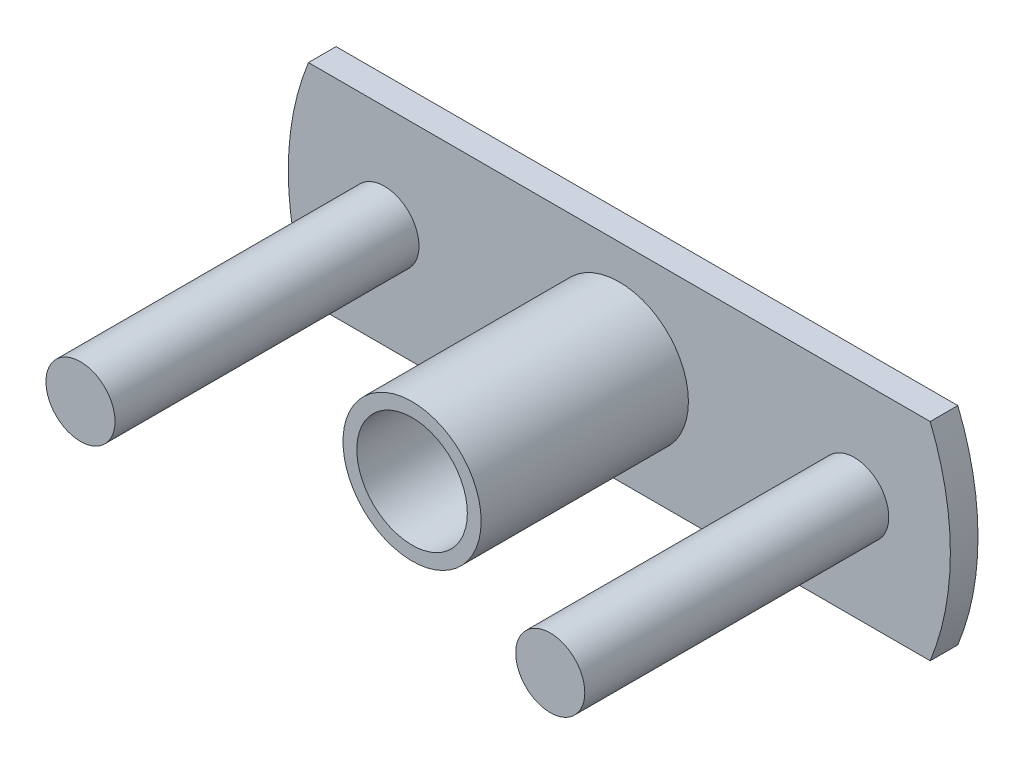
ISO-10303-21;
HEADER;
FILE_DESCRIPTION(('STEP AP214'),'2;1');
FILE_NAME('part.step','',(''),(''),'','','');
FILE_SCHEMA(('AUTOMOTIVE_DESIGN { 1 0 10303 214 1 1 1 1 }'));
ENDSEC;
DATA;
#1=APPLICATION_CONTEXT('core data for automotive mechanical design processes');
#2=APPLICATION_PROTOCOL_DEFINITION('international standard','automotive_design',2000,#1);
#3=PRODUCT_CONTEXT('',#1,'mechanical');
#4=PRODUCT('Part','Part','',(#3));
#5=PRODUCT_RELATED_PRODUCT_CATEGORY('part','',(#4));
#6=PRODUCT_DEFINITION_FORMATION('','',#4);
#7=PRODUCT_DEFINITION_CONTEXT('part definition',#1,'design');
#8=PRODUCT_DEFINITION('design','',#6,#7);
#9=PRODUCT_DEFINITION_SHAPE('','',#8);
#10=(LENGTH_UNIT() NAMED_UNIT(*) SI_UNIT(.MILLI.,.METRE.));
#11=(NAMED_UNIT(*) PLANE_ANGLE_UNIT() SI_UNIT($,.RADIAN.));
#12=(NAMED_UNIT(*) SI_UNIT($,.STERADIAN.) SOLID_ANGLE_UNIT());
#13=UNCERTAINTY_MEASURE_WITH_UNIT(LENGTH_MEASURE(1.E-05),#10,'distance_accuracy_value','');
#14=(GEOMETRIC_REPRESENTATION_CONTEXT(3) GLOBAL_UNCERTAINTY_ASSIGNED_CONTEXT((#13)) GLOBAL_UNIT_ASSIGNED_CONTEXT((#10,
#11,#12)) REPRESENTATION_CONTEXT('',''));
#15=CARTESIAN_POINT('',(0.,0.,0.));
#16=DIRECTION('',(0.,0.,1.));
#17=DIRECTION('',(1.,0.,0.));
#18=AXIS2_PLACEMENT_3D('',#15,#16,#17);
#19=CARTESIAN_POINT('',(-3.95950378226084,0.,2.));
#20=DIRECTION('',(0.,0.,-1.));
#21=DIRECTION('',(-1.,0.,0.));
#22=AXIS2_PLACEMENT_3D('',#19,#20,#21);
#23=CYLINDRICAL_SURFACE('',#22,20.);
#24=CARTESIAN_POINT('',(-3.95950378226084,0.,0.));
#25=DIRECTION('',(0.,0.,1.));
#26=DIRECTION('',(1.,0.,0.));
#27=AXIS2_PLACEMENT_3D('',#24,#25,#26);
#28=CIRCLE('',#27,20.);
#29=CARTESIAN_POINT('',(-22.5,7.5,0.));
#30=VERTEX_POINT('',#29);
#31=CARTESIAN_POINT('',(-22.5,-7.5,0.));
#32=VERTEX_POINT('',#31);
#33=EDGE_CURVE('E110',#30,#32,#28,.T.);
#34=ORIENTED_EDGE('',*,*,#33,.T.);
#35=DIRECTION('',(0.,0.,-1.));
#36=VECTOR('',#35,1.);
#37=CARTESIAN_POINT('',(-22.5,-7.5,2.));
#38=LINE('',#37,#36);
#39=CARTESIAN_POINT('',(-22.5,-7.5,2.));
#40=VERTEX_POINT('',#39);
#41=EDGE_CURVE('E42',#40,#32,#38,.T.);
#42=ORIENTED_EDGE('',*,*,#41,.F.);
#43=CARTESIAN_POINT('',(-3.95950378226084,0.,2.));
#44=DIRECTION('',(0.,0.,1.));
#45=DIRECTION('',(1.,0.,0.));
#46=AXIS2_PLACEMENT_3D('',#43,#44,#45);
#47=CIRCLE('',#46,20.);
#48=CARTESIAN_POINT('',(-22.5,7.5,2.));
#49=VERTEX_POINT('',#48);
#50=EDGE_CURVE('E91',#49,#40,#47,.T.);
#51=ORIENTED_EDGE('',*,*,#50,.F.);
#52=DIRECTION('',(0.,0.,-1.));
#53=VECTOR('',#52,1.);
#54=CARTESIAN_POINT('',(-22.5,7.5,2.));
#55=LINE('',#54,#53);
#56=EDGE_CURVE('E57',#49,#30,#55,.T.);
#57=ORIENTED_EDGE('',*,*,#56,.T.);
#58=EDGE_LOOP('',(#34,#42,#51,#57));
#59=FACE_BOUND('',#58,.T.);
#60=ADVANCED_FACE('F39',(#59),#23,.T.);
#61=CARTESIAN_POINT('',(-22.5,-7.5,2.));
#62=DIRECTION('',(0.,1.,0.));
#63=DIRECTION('',(0.,0.,1.));
#64=AXIS2_PLACEMENT_3D('',#61,#62,#63);
#65=PLANE('',#64);
#66=DIRECTION('',(1.,0.,0.));
#67=VECTOR('',#66,1.);
#68=CARTESIAN_POINT('',(-22.5,-7.5,0.));
#69=LINE('',#68,#67);
#70=CARTESIAN_POINT('',(22.5,-7.49999999999999,0.));
#71=VERTEX_POINT('',#70);
#72=EDGE_CURVE('E98',#32,#71,#69,.T.);
#73=ORIENTED_EDGE('',*,*,#72,.T.);
#74=DIRECTION('',(0.,0.,-1.));
#75=VECTOR('',#74,1.);
#76=CARTESIAN_POINT('',(22.5,-7.49999999999999,2.));
#77=LINE('',#76,#75);
#78=CARTESIAN_POINT('',(22.5,-7.49999999999999,2.));
#79=VERTEX_POINT('',#78);
#80=EDGE_CURVE('E96',#79,#71,#77,.T.);
#81=ORIENTED_EDGE('',*,*,#80,.F.);
#82=DIRECTION('',(1.,0.,0.));
#83=VECTOR('',#82,1.);
#84=CARTESIAN_POINT('',(-22.5,-7.5,2.));
#85=LINE('',#84,#83);
#86=EDGE_CURVE('E83',#40,#79,#85,.T.);
#87=ORIENTED_EDGE('',*,*,#86,.F.);
#88=ORIENTED_EDGE('',*,*,#41,.T.);
#89=EDGE_LOOP('',(#73,#81,#87,#88));
#90=FACE_BOUND('',#89,.T.);
#91=ADVANCED_FACE('F97',(#90),#65,.F.);
#92=CARTESIAN_POINT('',(3.95950378226085,0.,2.));
#93=DIRECTION('',(0.,0.,-1.));
#94=DIRECTION('',(-1.,0.,0.));
#95=AXIS2_PLACEMENT_3D('',#92,#93,#94);
#96=CYLINDRICAL_SURFACE('',#95,20.);
#97=CARTESIAN_POINT('',(3.95950378226085,0.,0.));
#98=DIRECTION('',(0.,0.,-1.));
#99=DIRECTION('',(-1.,0.,0.));
#100=AXIS2_PLACEMENT_3D('',#97,#98,#99);
#101=CIRCLE('',#100,20.);
#102=CARTESIAN_POINT('',(22.5,7.5,0.));
#103=VERTEX_POINT('',#102);
#104=EDGE_CURVE('E116',#103,#71,#101,.T.);
#105=ORIENTED_EDGE('',*,*,#104,.F.);
#106=DIRECTION('',(0.,0.,-1.));
#107=VECTOR('',#106,1.);
#108=CARTESIAN_POINT('',(22.5,7.5,2.));
#109=LINE('',#108,#107);
#110=CARTESIAN_POINT('',(22.5,7.5,2.));
#111=VERTEX_POINT('',#110);
#112=EDGE_CURVE('E71',#111,#103,#109,.T.);
#113=ORIENTED_EDGE('',*,*,#112,.F.);
#114=CARTESIAN_POINT('',(3.95950378226085,0.,2.));
#115=DIRECTION('',(0.,0.,-1.));
#116=DIRECTION('',(-1.,0.,0.));
#117=AXIS2_PLACEMENT_3D('',#114,#115,#116);
#118=CIRCLE('',#117,20.);
#119=EDGE_CURVE('E90',#111,#79,#118,.T.);
#120=ORIENTED_EDGE('',*,*,#119,.T.);
#121=ORIENTED_EDGE('',*,*,#80,.T.);
#122=EDGE_LOOP('',(#105,#113,#120,#121));
#123=FACE_BOUND('',#122,.T.);
#124=ADVANCED_FACE('F102',(#123),#96,.T.);
#125=CARTESIAN_POINT('',(-22.5,7.5,2.));
#126=DIRECTION('',(0.,1.,0.));
#127=DIRECTION('',(0.,0.,1.));
#128=AXIS2_PLACEMENT_3D('',#125,#126,#127);
#129=PLANE('',#128);
#130=DIRECTION('',(1.,0.,0.));
#131=VECTOR('',#130,1.);
#132=CARTESIAN_POINT('',(-22.5,7.5,0.));
#133=LINE('',#132,#131);
#134=EDGE_CURVE('E119',#30,#103,#133,.T.);
#135=ORIENTED_EDGE('',*,*,#134,.F.);
#136=ORIENTED_EDGE('',*,*,#56,.F.);
#137=DIRECTION('',(1.,0.,0.));
#138=VECTOR('',#137,1.);
#139=CARTESIAN_POINT('',(-22.5,7.5,2.));
#140=LINE('',#139,#138);
#141=EDGE_CURVE('E104',#49,#111,#140,.T.);
#142=ORIENTED_EDGE('',*,*,#141,.T.);
#143=ORIENTED_EDGE('',*,*,#112,.T.);
#144=EDGE_LOOP('',(#135,#136,#142,#143));
#145=FACE_BOUND('',#144,.T.);
#146=ADVANCED_FACE('F129',(#145),#129,.T.);
#147=CARTESIAN_POINT('',(-3.95950378226084,0.,2.));
#148=DIRECTION('',(0.,0.,1.));
#149=DIRECTION('',(1.,0.,0.));
#150=AXIS2_PLACEMENT_3D('',#147,#148,#149);
#151=PLANE('',#150);
#152=CARTESIAN_POINT('',(17.,0.,2.));
#153=DIRECTION('',(0.,0.,1.));
#154=DIRECTION('',(1.,0.,0.));
#155=AXIS2_PLACEMENT_3D('',#152,#153,#154);
#156=CIRCLE('',#155,2.5);
#157=CARTESIAN_POINT('',(19.5,0.,2.));
#158=VERTEX_POINT('',#157);
#159=EDGE_CURVE('E256',#158,#158,#156,.T.);
#160=ORIENTED_EDGE('',*,*,#159,.F.);
#161=EDGE_LOOP('',(#160));
#162=FACE_BOUND('',#161,.T.);
#163=CARTESIAN_POINT('',(-17.,0.,2.));
#164=DIRECTION('',(0.,0.,1.));
#165=DIRECTION('',(1.,0.,0.));
#166=AXIS2_PLACEMENT_3D('',#163,#164,#165);
#167=CIRCLE('',#166,2.5);
#168=CARTESIAN_POINT('',(-14.5,0.,2.));
#169=VERTEX_POINT('',#168);
#170=EDGE_CURVE('E255',#169,#169,#167,.T.);
#171=ORIENTED_EDGE('',*,*,#170,.F.);
#172=EDGE_LOOP('',(#171));
#173=FACE_BOUND('',#172,.T.);
#174=CARTESIAN_POINT('',(0.,0.,2.));
#175=DIRECTION('',(0.,0.,1.));
#176=DIRECTION('',(1.,0.,0.));
#177=AXIS2_PLACEMENT_3D('',#174,#175,#176);
#178=CIRCLE('',#177,5.);
#179=CARTESIAN_POINT('',(5.,0.,2.));
#180=VERTEX_POINT('',#179);
#181=EDGE_CURVE('E11',#180,#180,#178,.T.);
#182=ORIENTED_EDGE('',*,*,#181,.F.);
#183=EDGE_LOOP('',(#182));
#184=FACE_BOUND('',#183,.T.);
#185=ORIENTED_EDGE('',*,*,#50,.T.);
#186=ORIENTED_EDGE('',*,*,#86,.T.);
#187=ORIENTED_EDGE('',*,*,#119,.F.);
#188=ORIENTED_EDGE('',*,*,#141,.F.);
#189=EDGE_LOOP('',(#185,#186,#187,#188));
#190=FACE_BOUND('',#189,.T.);
#191=ADVANCED_FACE('F87',(#162,#173,#184,#190),#151,.T.);
#192=CARTESIAN_POINT('',(-3.95950378226084,0.,0.));
#193=DIRECTION('',(0.,0.,1.));
#194=DIRECTION('',(1.,0.,0.));
#195=AXIS2_PLACEMENT_3D('',#192,#193,#194);
#196=PLANE('',#195);
#197=ORIENTED_EDGE('',*,*,#33,.F.);
#198=ORIENTED_EDGE('',*,*,#134,.T.);
#199=ORIENTED_EDGE('',*,*,#104,.T.);
#200=ORIENTED_EDGE('',*,*,#72,.F.);
#201=EDGE_LOOP('',(#197,#198,#199,#200));
#202=FACE_BOUND('',#201,.T.);
#203=ADVANCED_FACE('F128',(#202),#196,.F.);
#204=CARTESIAN_POINT('',(0.,0.,17.));
#205=DIRECTION('',(0.,0.,-1.));
#206=DIRECTION('',(-1.,0.,0.));
#207=AXIS2_PLACEMENT_3D('',#204,#205,#206);
#208=CYLINDRICAL_SURFACE('',#207,5.);
#209=CARTESIAN_POINT('',(0.,0.,17.));
#210=DIRECTION('',(0.,0.,1.));
#211=DIRECTION('',(1.,0.,0.));
#212=AXIS2_PLACEMENT_3D('',#209,#210,#211);
#213=CIRCLE('',#212,5.);
#214=CARTESIAN_POINT('',(5.,0.,17.));
#215=VERTEX_POINT('',#214);
#216=EDGE_CURVE('E113',#215,#215,#213,.T.);
#217=ORIENTED_EDGE('',*,*,#216,.F.);
#218=EDGE_LOOP('',(#217));
#219=FACE_BOUND('',#218,.T.);
#220=ORIENTED_EDGE('',*,*,#181,.T.);
#221=EDGE_LOOP('',(#220));
#222=FACE_BOUND('',#221,.T.);
#223=ADVANCED_FACE('F164',(#219,#222),#208,.T.);
#224=CARTESIAN_POINT('',(0.,0.,17.));
#225=DIRECTION('',(0.,0.,1.));
#226=DIRECTION('',(1.,0.,0.));
#227=AXIS2_PLACEMENT_3D('',#224,#225,#226);
#228=PLANE('',#227);
#229=CARTESIAN_POINT('',(0.,0.,17.));
#230=DIRECTION('',(0.,0.,1.));
#231=DIRECTION('',(1.,0.,0.));
#232=AXIS2_PLACEMENT_3D('',#229,#230,#231);
#233=CIRCLE('',#232,4.);
#234=CARTESIAN_POINT('',(4.,0.,17.));
#235=VERTEX_POINT('',#234);
#236=EDGE_CURVE('E268',#235,#235,#233,.T.);
#237=ORIENTED_EDGE('',*,*,#236,.F.);
#238=EDGE_LOOP('',(#237));
#239=FACE_BOUND('',#238,.T.);
#240=ORIENTED_EDGE('',*,*,#216,.T.);
#241=EDGE_LOOP('',(#240));
#242=FACE_BOUND('',#241,.T.);
#243=ADVANCED_FACE('F172',(#239,#242),#228,.T.);
#244=CARTESIAN_POINT('',(0.,0.,7.));
#245=DIRECTION('',(0.,0.,1.));
#246=DIRECTION('',(1.,0.,0.));
#247=AXIS2_PLACEMENT_3D('',#244,#245,#246);
#248=CYLINDRICAL_SURFACE('',#247,4.);
#249=CARTESIAN_POINT('',(0.,0.,7.));
#250=DIRECTION('',(0.,0.,1.));
#251=DIRECTION('',(1.,0.,0.));
#252=AXIS2_PLACEMENT_3D('',#249,#250,#251);
#253=CIRCLE('',#252,4.);
#254=CARTESIAN_POINT('',(4.,0.,7.));
#255=VERTEX_POINT('',#254);
#256=EDGE_CURVE('E270',#255,#255,#253,.T.);
#257=ORIENTED_EDGE('',*,*,#256,.F.);
#258=EDGE_LOOP('',(#257));
#259=FACE_BOUND('',#258,.T.);
#260=ORIENTED_EDGE('',*,*,#236,.T.);
#261=EDGE_LOOP('',(#260));
#262=FACE_BOUND('',#261,.T.);
#263=ADVANCED_FACE('F182',(#259,#262),#248,.F.);
#264=CARTESIAN_POINT('',(0.,0.,7.));
#265=DIRECTION('',(0.,0.,1.));
#266=DIRECTION('',(1.,0.,0.));
#267=AXIS2_PLACEMENT_3D('',#264,#265,#266);
#268=PLANE('',#267);
#269=ORIENTED_EDGE('',*,*,#256,.T.);
#270=EDGE_LOOP('',(#269));
#271=FACE_BOUND('',#270,.T.);
#272=ADVANCED_FACE('F192',(#271),#268,.T.);
#273=CARTESIAN_POINT('',(-17.,0.,24.));
#274=DIRECTION('',(0.,0.,-1.));
#275=DIRECTION('',(-1.,0.,0.));
#276=AXIS2_PLACEMENT_3D('',#273,#274,#275);
#277=CYLINDRICAL_SURFACE('',#276,2.5);
#278=CARTESIAN_POINT('',(-17.,0.,24.));
#279=DIRECTION('',(0.,0.,1.));
#280=DIRECTION('',(1.,0.,0.));
#281=AXIS2_PLACEMENT_3D('',#278,#279,#280);
#282=CIRCLE('',#281,2.5);
#283=CARTESIAN_POINT('',(-14.5,0.,24.));
#284=VERTEX_POINT('',#283);
#285=EDGE_CURVE('E261',#284,#284,#282,.T.);
#286=ORIENTED_EDGE('',*,*,#285,.F.);
#287=EDGE_LOOP('',(#286));
#288=FACE_BOUND('',#287,.T.);
#289=ORIENTED_EDGE('',*,*,#170,.T.);
#290=EDGE_LOOP('',(#289));
#291=FACE_BOUND('',#290,.T.);
#292=ADVANCED_FACE('F202',(#288,#291),#277,.T.);
#293=CARTESIAN_POINT('',(-17.,0.,24.));
#294=DIRECTION('',(0.,0.,1.));
#295=DIRECTION('',(1.,0.,0.));
#296=AXIS2_PLACEMENT_3D('',#293,#294,#295);
#297=PLANE('',#296);
#298=ORIENTED_EDGE('',*,*,#285,.T.);
#299=EDGE_LOOP('',(#298));
#300=FACE_BOUND('',#299,.T.);
#301=ADVANCED_FACE('F217',(#300),#297,.T.);
#302=CARTESIAN_POINT('',(17.,0.,24.));
#303=DIRECTION('',(0.,0.,-1.));
#304=DIRECTION('',(-1.,0.,0.));
#305=AXIS2_PLACEMENT_3D('',#302,#303,#304);
#306=CYLINDRICAL_SURFACE('',#305,2.5);
#307=CARTESIAN_POINT('',(17.,0.,24.));
#308=DIRECTION('',(0.,0.,1.));
#309=DIRECTION('',(1.,0.,0.));
#310=AXIS2_PLACEMENT_3D('',#307,#308,#309);
#311=CIRCLE('',#310,2.5);
#312=CARTESIAN_POINT('',(19.5,0.,24.));
#313=VERTEX_POINT('',#312);
#314=EDGE_CURVE('E253',#313,#313,#311,.T.);
#315=ORIENTED_EDGE('',*,*,#314,.F.);
#316=EDGE_LOOP('',(#315));
#317=FACE_BOUND('',#316,.T.);
#318=ORIENTED_EDGE('',*,*,#159,.T.);
#319=EDGE_LOOP('',(#318));
#320=FACE_BOUND('',#319,.T.);
#321=ADVANCED_FACE('F227',(#317,#320),#306,.T.);
#322=CARTESIAN_POINT('',(17.,0.,24.));
#323=DIRECTION('',(0.,0.,1.));
#324=DIRECTION('',(1.,0.,0.));
#325=AXIS2_PLACEMENT_3D('',#322,#323,#324);
#326=PLANE('',#325);
#327=ORIENTED_EDGE('',*,*,#314,.T.);
#328=EDGE_LOOP('',(#327));
#329=FACE_BOUND('',#328,.T.);
#330=ADVANCED_FACE('F237',(#329),#326,.T.);
#331=CLOSED_SHELL('',(#60,#91,#124,#146,#191,#203,#223,#243,#263,#272,#292,#301,#321,#330));
#332=MANIFOLD_SOLID_BREP('B2',#331);
#333=ADVANCED_BREP_SHAPE_REPRESENTATION('',(#18,#332),#14);
#334=SHAPE_DEFINITION_REPRESENTATION(#9,#333);
ENDSEC;
END-ISO-10303-21;
